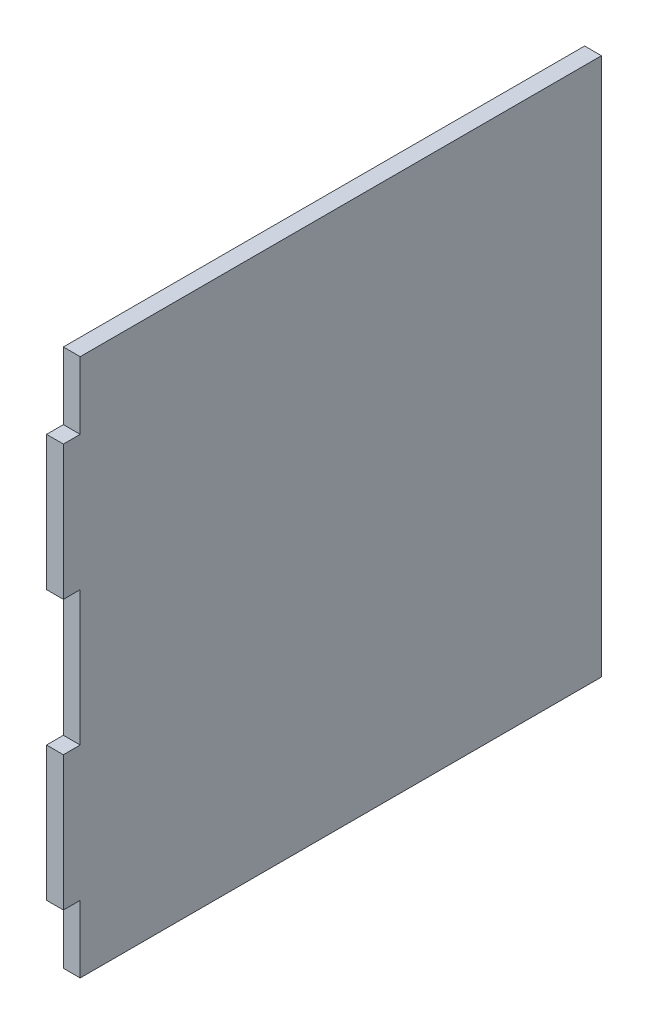
ISO-10303-21;
HEADER;
FILE_DESCRIPTION(('STEP AP214'),'2;1');
FILE_NAME('part.step','',(''),(''),'','','');
FILE_SCHEMA(('AUTOMOTIVE_DESIGN { 1 0 10303 214 1 1 1 1 }'));
ENDSEC;
DATA;
#1=APPLICATION_CONTEXT('core data for automotive mechanical design processes');
#2=APPLICATION_PROTOCOL_DEFINITION('international standard','automotive_design',2000,#1);
#3=PRODUCT_CONTEXT('',#1,'mechanical');
#4=PRODUCT('Part','Part','',(#3));
#5=PRODUCT_RELATED_PRODUCT_CATEGORY('part','',(#4));
#6=PRODUCT_DEFINITION_FORMATION('','',#4);
#7=PRODUCT_DEFINITION_CONTEXT('part definition',#1,'design');
#8=PRODUCT_DEFINITION('design','',#6,#7);
#9=PRODUCT_DEFINITION_SHAPE('','',#8);
#10=(LENGTH_UNIT() NAMED_UNIT(*) SI_UNIT(.MILLI.,.METRE.));
#11=(NAMED_UNIT(*) PLANE_ANGLE_UNIT() SI_UNIT($,.RADIAN.));
#12=(NAMED_UNIT(*) SI_UNIT($,.STERADIAN.) SOLID_ANGLE_UNIT());
#13=UNCERTAINTY_MEASURE_WITH_UNIT(LENGTH_MEASURE(1.E-05),#10,'distance_accuracy_value','');
#14=(GEOMETRIC_REPRESENTATION_CONTEXT(3) GLOBAL_UNCERTAINTY_ASSIGNED_CONTEXT((#13)) GLOBAL_UNIT_ASSIGNED_CONTEXT((#10,
#11,#12)) REPRESENTATION_CONTEXT('',''));
#15=CARTESIAN_POINT('',(0.,0.,0.));
#16=DIRECTION('',(0.,0.,1.));
#17=DIRECTION('',(1.,0.,0.));
#18=AXIS2_PLACEMENT_3D('',#15,#16,#17);
#19=CARTESIAN_POINT('',(5.,80.,80.));
#20=DIRECTION('',(0.,0.,-1.));
#21=DIRECTION('',(-1.,0.,0.));
#22=AXIS2_PLACEMENT_3D('',#19,#20,#21);
#23=PLANE('',#22);
#24=DIRECTION('',(1.,0.,0.));
#25=VECTOR('',#24,1.);
#26=CARTESIAN_POINT('',(0.,60.,80.));
#27=LINE('',#26,#25);
#28=CARTESIAN_POINT('',(0.,60.,80.));
#29=VERTEX_POINT('',#28);
#30=CARTESIAN_POINT('',(5.,60.,80.));
#31=VERTEX_POINT('',#30);
#32=EDGE_CURVE('E150',#29,#31,#27,.T.);
#33=ORIENTED_EDGE('',*,*,#32,.F.);
#34=DIRECTION('',(0.,-1.,0.));
#35=VECTOR('',#34,1.);
#36=CARTESIAN_POINT('',(0.,80.,80.));
#37=LINE('',#36,#35);
#38=CARTESIAN_POINT('',(0.,20.,80.));
#39=VERTEX_POINT('',#38);
#40=EDGE_CURVE('E143',#29,#39,#37,.T.);
#41=ORIENTED_EDGE('',*,*,#40,.T.);
#42=DIRECTION('',(1.,0.,0.));
#43=VECTOR('',#42,1.);
#44=CARTESIAN_POINT('',(0.,20.,80.));
#45=LINE('',#44,#43);
#46=CARTESIAN_POINT('',(5.,20.,80.));
#47=VERTEX_POINT('',#46);
#48=EDGE_CURVE('E175',#39,#47,#45,.T.);
#49=ORIENTED_EDGE('',*,*,#48,.T.);
#50=DIRECTION('',(0.,-1.,0.));
#51=VECTOR('',#50,1.);
#52=CARTESIAN_POINT('',(5.,80.,80.));
#53=LINE('',#52,#51);
#54=EDGE_CURVE('E204',#31,#47,#53,.T.);
#55=ORIENTED_EDGE('',*,*,#54,.F.);
#56=EDGE_LOOP('',(#33,#41,#49,#55));
#57=FACE_BOUND('',#56,.T.);
#58=ADVANCED_FACE('F36',(#57),#23,.F.);
#59=DIRECTION('',(1.,0.,0.));
#60=VECTOR('',#59,1.);
#61=CARTESIAN_POINT('',(0.,-20.,80.));
#62=LINE('',#61,#60);
#63=CARTESIAN_POINT('',(0.,-20.,80.));
#64=VERTEX_POINT('',#63);
#65=CARTESIAN_POINT('',(5.,-20.,80.));
#66=VERTEX_POINT('',#65);
#67=EDGE_CURVE('E173',#64,#66,#62,.T.);
#68=ORIENTED_EDGE('',*,*,#67,.F.);
#69=CARTESIAN_POINT('',(0.,-60.,80.));
#70=VERTEX_POINT('',#69);
#71=EDGE_CURVE('E211',#64,#70,#37,.T.);
#72=ORIENTED_EDGE('',*,*,#71,.T.);
#73=DIRECTION('',(1.,0.,0.));
#74=VECTOR('',#73,1.);
#75=CARTESIAN_POINT('',(0.,-60.,80.));
#76=LINE('',#75,#74);
#77=CARTESIAN_POINT('',(5.,-60.,80.));
#78=VERTEX_POINT('',#77);
#79=EDGE_CURVE('E166',#70,#78,#76,.T.);
#80=ORIENTED_EDGE('',*,*,#79,.T.);
#81=EDGE_CURVE('E201',#66,#78,#53,.T.);
#82=ORIENTED_EDGE('',*,*,#81,.F.);
#83=EDGE_LOOP('',(#68,#72,#80,#82));
#84=FACE_BOUND('',#83,.T.);
#85=ADVANCED_FACE('F237',(#84),#23,.F.);
#86=CARTESIAN_POINT('',(5.,0.,0.));
#87=DIRECTION('',(1.,0.,0.));
#88=DIRECTION('',(0.,0.,-1.));
#89=AXIS2_PLACEMENT_3D('',#86,#87,#88);
#90=PLANE('',#89);
#91=DIRECTION('',(0.,1.,0.));
#92=VECTOR('',#91,1.);
#93=CARTESIAN_POINT('',(5.,0.,75.));
#94=LINE('',#93,#92);
#95=CARTESIAN_POINT('',(5.,60.,75.));
#96=VERTEX_POINT('',#95);
#97=CARTESIAN_POINT('',(5.,80.,75.));
#98=VERTEX_POINT('',#97);
#99=EDGE_CURVE('E144',#96,#98,#94,.T.);
#100=ORIENTED_EDGE('',*,*,#99,.F.);
#101=DIRECTION('',(0.,0.,1.));
#102=VECTOR('',#101,1.);
#103=CARTESIAN_POINT('',(5.,60.,0.));
#104=LINE('',#103,#102);
#105=EDGE_CURVE('E131',#96,#31,#104,.T.);
#106=ORIENTED_EDGE('',*,*,#105,.T.);
#107=ORIENTED_EDGE('',*,*,#54,.T.);
#108=DIRECTION('',(0.,0.,-1.));
#109=VECTOR('',#108,1.);
#110=CARTESIAN_POINT('',(5.,20.,0.));
#111=LINE('',#110,#109);
#112=CARTESIAN_POINT('',(5.,20.,75.));
#113=VERTEX_POINT('',#112);
#114=EDGE_CURVE('E165',#47,#113,#111,.T.);
#115=ORIENTED_EDGE('',*,*,#114,.T.);
#116=DIRECTION('',(0.,-1.,0.));
#117=VECTOR('',#116,1.);
#118=CARTESIAN_POINT('',(5.,0.,75.));
#119=LINE('',#118,#117);
#120=CARTESIAN_POINT('',(5.,-20.,75.));
#121=VERTEX_POINT('',#120);
#122=EDGE_CURVE('E162',#113,#121,#119,.T.);
#123=ORIENTED_EDGE('',*,*,#122,.T.);
#124=DIRECTION('',(0.,0.,1.));
#125=VECTOR('',#124,1.);
#126=CARTESIAN_POINT('',(5.,-19.9999999999999,0.));
#127=LINE('',#126,#125);
#128=EDGE_CURVE('E157',#121,#66,#127,.T.);
#129=ORIENTED_EDGE('',*,*,#128,.T.);
#130=ORIENTED_EDGE('',*,*,#81,.T.);
#131=DIRECTION('',(0.,0.,-1.));
#132=VECTOR('',#131,1.);
#133=CARTESIAN_POINT('',(5.,-60.,0.));
#134=LINE('',#133,#132);
#135=CARTESIAN_POINT('',(5.,-60.,75.));
#136=VERTEX_POINT('',#135);
#137=EDGE_CURVE('E183',#78,#136,#134,.T.);
#138=ORIENTED_EDGE('',*,*,#137,.T.);
#139=DIRECTION('',(0.,1.,0.));
#140=VECTOR('',#139,1.);
#141=CARTESIAN_POINT('',(5.,0.,75.));
#142=LINE('',#141,#140);
#143=CARTESIAN_POINT('',(5.,-80.,75.));
#144=VERTEX_POINT('',#143);
#145=EDGE_CURVE('E186',#144,#136,#142,.T.);
#146=ORIENTED_EDGE('',*,*,#145,.F.);
#147=DIRECTION('',(0.,0.,-1.));
#148=VECTOR('',#147,1.);
#149=CARTESIAN_POINT('',(5.,-80.,80.));
#150=LINE('',#149,#148);
#151=CARTESIAN_POINT('',(5.,-80.,-80.));
#152=VERTEX_POINT('',#151);
#153=EDGE_CURVE('E205',#144,#152,#150,.T.);
#154=ORIENTED_EDGE('',*,*,#153,.T.);
#155=DIRECTION('',(0.,1.,0.));
#156=VECTOR('',#155,1.);
#157=CARTESIAN_POINT('',(5.,80.,-80.));
#158=LINE('',#157,#156);
#159=CARTESIAN_POINT('',(5.,80.,-80.));
#160=VERTEX_POINT('',#159);
#161=EDGE_CURVE('E194',#152,#160,#158,.T.);
#162=ORIENTED_EDGE('',*,*,#161,.T.);
#163=DIRECTION('',(0.,0.,1.));
#164=VECTOR('',#163,1.);
#165=CARTESIAN_POINT('',(5.,80.,80.));
#166=LINE('',#165,#164);
#167=EDGE_CURVE('E197',#160,#98,#166,.T.);
#168=ORIENTED_EDGE('',*,*,#167,.T.);
#169=EDGE_LOOP('',(#100,#106,#107,#115,#123,#129,#130,#138,#146,#154,#162,#168));
#170=FACE_BOUND('',#169,.T.);
#171=ADVANCED_FACE('F226',(#170),#90,.T.);
#172=CARTESIAN_POINT('',(0.,0.,0.));
#173=DIRECTION('',(1.,0.,0.));
#174=DIRECTION('',(0.,0.,-1.));
#175=AXIS2_PLACEMENT_3D('',#172,#173,#174);
#176=PLANE('',#175);
#177=DIRECTION('',(0.,0.,1.));
#178=VECTOR('',#177,1.);
#179=CARTESIAN_POINT('',(0.,60.,0.));
#180=LINE('',#179,#178);
#181=CARTESIAN_POINT('',(0.,60.,75.));
#182=VERTEX_POINT('',#181);
#183=EDGE_CURVE('E128',#182,#29,#180,.T.);
#184=ORIENTED_EDGE('',*,*,#183,.F.);
#185=DIRECTION('',(0.,1.,0.));
#186=VECTOR('',#185,1.);
#187=CARTESIAN_POINT('',(0.,0.,75.));
#188=LINE('',#187,#186);
#189=CARTESIAN_POINT('',(0.,80.,75.));
#190=VERTEX_POINT('',#189);
#191=EDGE_CURVE('E133',#182,#190,#188,.T.);
#192=ORIENTED_EDGE('',*,*,#191,.T.);
#193=DIRECTION('',(0.,0.,1.));
#194=VECTOR('',#193,1.);
#195=CARTESIAN_POINT('',(0.,80.,80.));
#196=LINE('',#195,#194);
#197=CARTESIAN_POINT('',(0.,80.,-80.));
#198=VERTEX_POINT('',#197);
#199=EDGE_CURVE('E209',#198,#190,#196,.T.);
#200=ORIENTED_EDGE('',*,*,#199,.F.);
#201=DIRECTION('',(0.,1.,0.));
#202=VECTOR('',#201,1.);
#203=CARTESIAN_POINT('',(0.,80.,-80.));
#204=LINE('',#203,#202);
#205=CARTESIAN_POINT('',(0.,-80.,-80.));
#206=VERTEX_POINT('',#205);
#207=EDGE_CURVE('E152',#206,#198,#204,.T.);
#208=ORIENTED_EDGE('',*,*,#207,.F.);
#209=DIRECTION('',(0.,0.,-1.));
#210=VECTOR('',#209,1.);
#211=CARTESIAN_POINT('',(0.,-80.,80.));
#212=LINE('',#211,#210);
#213=CARTESIAN_POINT('',(0.,-80.,75.));
#214=VERTEX_POINT('',#213);
#215=EDGE_CURVE('E198',#214,#206,#212,.T.);
#216=ORIENTED_EDGE('',*,*,#215,.F.);
#217=DIRECTION('',(0.,1.,0.));
#218=VECTOR('',#217,1.);
#219=CARTESIAN_POINT('',(0.,0.,75.));
#220=LINE('',#219,#218);
#221=CARTESIAN_POINT('',(0.,-60.,75.));
#222=VERTEX_POINT('',#221);
#223=EDGE_CURVE('E179',#214,#222,#220,.T.);
#224=ORIENTED_EDGE('',*,*,#223,.T.);
#225=DIRECTION('',(0.,0.,-1.));
#226=VECTOR('',#225,1.);
#227=CARTESIAN_POINT('',(0.,-60.,0.));
#228=LINE('',#227,#226);
#229=EDGE_CURVE('E182',#70,#222,#228,.T.);
#230=ORIENTED_EDGE('',*,*,#229,.F.);
#231=ORIENTED_EDGE('',*,*,#71,.F.);
#232=DIRECTION('',(0.,0.,1.));
#233=VECTOR('',#232,1.);
#234=CARTESIAN_POINT('',(0.,-19.9999999999999,0.));
#235=LINE('',#234,#233);
#236=CARTESIAN_POINT('',(0.,-20.,75.));
#237=VERTEX_POINT('',#236);
#238=EDGE_CURVE('E159',#237,#64,#235,.T.);
#239=ORIENTED_EDGE('',*,*,#238,.F.);
#240=DIRECTION('',(0.,-1.,0.));
#241=VECTOR('',#240,1.);
#242=CARTESIAN_POINT('',(0.,0.,75.));
#243=LINE('',#242,#241);
#244=CARTESIAN_POINT('',(0.,20.,75.));
#245=VERTEX_POINT('',#244);
#246=EDGE_CURVE('E154',#245,#237,#243,.T.);
#247=ORIENTED_EDGE('',*,*,#246,.F.);
#248=DIRECTION('',(0.,0.,-1.));
#249=VECTOR('',#248,1.);
#250=CARTESIAN_POINT('',(0.,20.,0.));
#251=LINE('',#250,#249);
#252=EDGE_CURVE('E156',#39,#245,#251,.T.);
#253=ORIENTED_EDGE('',*,*,#252,.F.);
#254=ORIENTED_EDGE('',*,*,#40,.F.);
#255=EDGE_LOOP('',(#184,#192,#200,#208,#216,#224,#230,#231,#239,#247,#253,#254));
#256=FACE_BOUND('',#255,.T.);
#257=ADVANCED_FACE('F140',(#256),#176,.F.);
#258=CARTESIAN_POINT('',(5.,80.,-80.));
#259=DIRECTION('',(0.,0.,1.));
#260=DIRECTION('',(1.,0.,0.));
#261=AXIS2_PLACEMENT_3D('',#258,#259,#260);
#262=PLANE('',#261);
#263=ORIENTED_EDGE('',*,*,#207,.T.);
#264=DIRECTION('',(-1.,0.,0.));
#265=VECTOR('',#264,1.);
#266=CARTESIAN_POINT('',(5.,80.,-80.));
#267=LINE('',#266,#265);
#268=EDGE_CURVE('E11',#160,#198,#267,.T.);
#269=ORIENTED_EDGE('',*,*,#268,.F.);
#270=ORIENTED_EDGE('',*,*,#161,.F.);
#271=DIRECTION('',(-1.,0.,0.));
#272=VECTOR('',#271,1.);
#273=CARTESIAN_POINT('',(5.,-80.,-80.));
#274=LINE('',#273,#272);
#275=EDGE_CURVE('E44',#152,#206,#274,.T.);
#276=ORIENTED_EDGE('',*,*,#275,.T.);
#277=EDGE_LOOP('',(#263,#269,#270,#276));
#278=FACE_BOUND('',#277,.T.);
#279=ADVANCED_FACE('F38',(#278),#262,.F.);
#280=CARTESIAN_POINT('',(5.,80.,80.));
#281=DIRECTION('',(0.,-1.,0.));
#282=DIRECTION('',(0.,0.,-1.));
#283=AXIS2_PLACEMENT_3D('',#280,#281,#282);
#284=PLANE('',#283);
#285=ORIENTED_EDGE('',*,*,#199,.T.);
#286=DIRECTION('',(1.,0.,0.));
#287=VECTOR('',#286,1.);
#288=CARTESIAN_POINT('',(0.,80.,75.));
#289=LINE('',#288,#287);
#290=EDGE_CURVE('E59',#190,#98,#289,.T.);
#291=ORIENTED_EDGE('',*,*,#290,.T.);
#292=ORIENTED_EDGE('',*,*,#167,.F.);
#293=ORIENTED_EDGE('',*,*,#268,.T.);
#294=EDGE_LOOP('',(#285,#291,#292,#293));
#295=FACE_BOUND('',#294,.T.);
#296=ADVANCED_FACE('F224',(#295),#284,.F.);
#297=CARTESIAN_POINT('',(5.,-80.,80.));
#298=DIRECTION('',(0.,1.,0.));
#299=DIRECTION('',(0.,0.,1.));
#300=AXIS2_PLACEMENT_3D('',#297,#298,#299);
#301=PLANE('',#300);
#302=ORIENTED_EDGE('',*,*,#153,.F.);
#303=DIRECTION('',(1.,0.,0.));
#304=VECTOR('',#303,1.);
#305=CARTESIAN_POINT('',(0.,-80.,75.));
#306=LINE('',#305,#304);
#307=EDGE_CURVE('E185',#214,#144,#306,.T.);
#308=ORIENTED_EDGE('',*,*,#307,.F.);
#309=ORIENTED_EDGE('',*,*,#215,.T.);
#310=ORIENTED_EDGE('',*,*,#275,.F.);
#311=EDGE_LOOP('',(#302,#308,#309,#310));
#312=FACE_BOUND('',#311,.T.);
#313=ADVANCED_FACE('F229',(#312),#301,.F.);
#314=CARTESIAN_POINT('',(0.,-60.,0.));
#315=DIRECTION('',(0.,-1.,0.));
#316=DIRECTION('',(0.,0.,-1.));
#317=AXIS2_PLACEMENT_3D('',#314,#315,#316);
#318=PLANE('',#317);
#319=ORIENTED_EDGE('',*,*,#137,.F.);
#320=ORIENTED_EDGE('',*,*,#79,.F.);
#321=ORIENTED_EDGE('',*,*,#229,.T.);
#322=DIRECTION('',(1.,0.,0.));
#323=VECTOR('',#322,1.);
#324=CARTESIAN_POINT('',(0.,-60.,75.));
#325=LINE('',#324,#323);
#326=EDGE_CURVE('E51',#222,#136,#325,.T.);
#327=ORIENTED_EDGE('',*,*,#326,.T.);
#328=EDGE_LOOP('',(#319,#320,#321,#327));
#329=FACE_BOUND('',#328,.T.);
#330=ADVANCED_FACE('F273',(#329),#318,.T.);
#331=CARTESIAN_POINT('',(0.,0.,75.));
#332=DIRECTION('',(0.,0.,-1.));
#333=DIRECTION('',(-1.,0.,0.));
#334=AXIS2_PLACEMENT_3D('',#331,#332,#333);
#335=PLANE('',#334);
#336=ORIENTED_EDGE('',*,*,#145,.T.);
#337=ORIENTED_EDGE('',*,*,#326,.F.);
#338=ORIENTED_EDGE('',*,*,#223,.F.);
#339=ORIENTED_EDGE('',*,*,#307,.T.);
#340=EDGE_LOOP('',(#336,#337,#338,#339));
#341=FACE_BOUND('',#340,.T.);
#342=ADVANCED_FACE('F230',(#341),#335,.F.);
#343=CARTESIAN_POINT('',(0.,0.,75.));
#344=DIRECTION('',(0.,0.,1.));
#345=DIRECTION('',(1.,0.,0.));
#346=AXIS2_PLACEMENT_3D('',#343,#344,#345);
#347=PLANE('',#346);
#348=ORIENTED_EDGE('',*,*,#122,.F.);
#349=DIRECTION('',(1.,0.,0.));
#350=VECTOR('',#349,1.);
#351=CARTESIAN_POINT('',(0.,20.,75.));
#352=LINE('',#351,#350);
#353=EDGE_CURVE('E161',#245,#113,#352,.T.);
#354=ORIENTED_EDGE('',*,*,#353,.F.);
#355=ORIENTED_EDGE('',*,*,#246,.T.);
#356=DIRECTION('',(1.,0.,0.));
#357=VECTOR('',#356,1.);
#358=CARTESIAN_POINT('',(0.,-20.,75.));
#359=LINE('',#358,#357);
#360=EDGE_CURVE('E148',#237,#121,#359,.T.);
#361=ORIENTED_EDGE('',*,*,#360,.T.);
#362=EDGE_LOOP('',(#348,#354,#355,#361));
#363=FACE_BOUND('',#362,.T.);
#364=ADVANCED_FACE('F246',(#363),#347,.T.);
#365=CARTESIAN_POINT('',(0.,-19.9999999999999,0.));
#366=DIRECTION('',(0.,1.,0.));
#367=DIRECTION('',(0.,0.,1.));
#368=AXIS2_PLACEMENT_3D('',#365,#366,#367);
#369=PLANE('',#368);
#370=ORIENTED_EDGE('',*,*,#128,.F.);
#371=ORIENTED_EDGE('',*,*,#360,.F.);
#372=ORIENTED_EDGE('',*,*,#238,.T.);
#373=ORIENTED_EDGE('',*,*,#67,.T.);
#374=EDGE_LOOP('',(#370,#371,#372,#373));
#375=FACE_BOUND('',#374,.T.);
#376=ADVANCED_FACE('F240',(#375),#369,.T.);
#377=CARTESIAN_POINT('',(0.,20.,0.));
#378=DIRECTION('',(0.,-1.,0.));
#379=DIRECTION('',(0.,0.,-1.));
#380=AXIS2_PLACEMENT_3D('',#377,#378,#379);
#381=PLANE('',#380);
#382=ORIENTED_EDGE('',*,*,#114,.F.);
#383=ORIENTED_EDGE('',*,*,#48,.F.);
#384=ORIENTED_EDGE('',*,*,#252,.T.);
#385=ORIENTED_EDGE('',*,*,#353,.T.);
#386=EDGE_LOOP('',(#382,#383,#384,#385));
#387=FACE_BOUND('',#386,.T.);
#388=ADVANCED_FACE('F251',(#387),#381,.T.);
#389=CARTESIAN_POINT('',(0.,60.,0.));
#390=DIRECTION('',(0.,1.,0.));
#391=DIRECTION('',(0.,0.,1.));
#392=AXIS2_PLACEMENT_3D('',#389,#390,#391);
#393=PLANE('',#392);
#394=ORIENTED_EDGE('',*,*,#105,.F.);
#395=DIRECTION('',(1.,0.,0.));
#396=VECTOR('',#395,1.);
#397=CARTESIAN_POINT('',(0.,60.,75.));
#398=LINE('',#397,#396);
#399=EDGE_CURVE('E125',#182,#96,#398,.T.);
#400=ORIENTED_EDGE('',*,*,#399,.F.);
#401=ORIENTED_EDGE('',*,*,#183,.T.);
#402=ORIENTED_EDGE('',*,*,#32,.T.);
#403=EDGE_LOOP('',(#394,#400,#401,#402));
#404=FACE_BOUND('',#403,.T.);
#405=ADVANCED_FACE('F126',(#404),#393,.T.);
#406=CARTESIAN_POINT('',(0.,0.,75.));
#407=DIRECTION('',(0.,0.,-1.));
#408=DIRECTION('',(-1.,0.,0.));
#409=AXIS2_PLACEMENT_3D('',#406,#407,#408);
#410=PLANE('',#409);
#411=ORIENTED_EDGE('',*,*,#99,.T.);
#412=ORIENTED_EDGE('',*,*,#290,.F.);
#413=ORIENTED_EDGE('',*,*,#191,.F.);
#414=ORIENTED_EDGE('',*,*,#399,.T.);
#415=EDGE_LOOP('',(#411,#412,#413,#414));
#416=FACE_BOUND('',#415,.T.);
#417=ADVANCED_FACE('F135',(#416),#410,.F.);
#418=CLOSED_SHELL('',(#58,#85,#171,#257,#279,#296,#313,#330,#342,#364,#376,#388,#405,#417));
#419=MANIFOLD_SOLID_BREP('B2',#418);
#420=ADVANCED_BREP_SHAPE_REPRESENTATION('',(#18,#419),#14);
#421=SHAPE_DEFINITION_REPRESENTATION(#9,#420);
ENDSEC;
END-ISO-10303-21;
